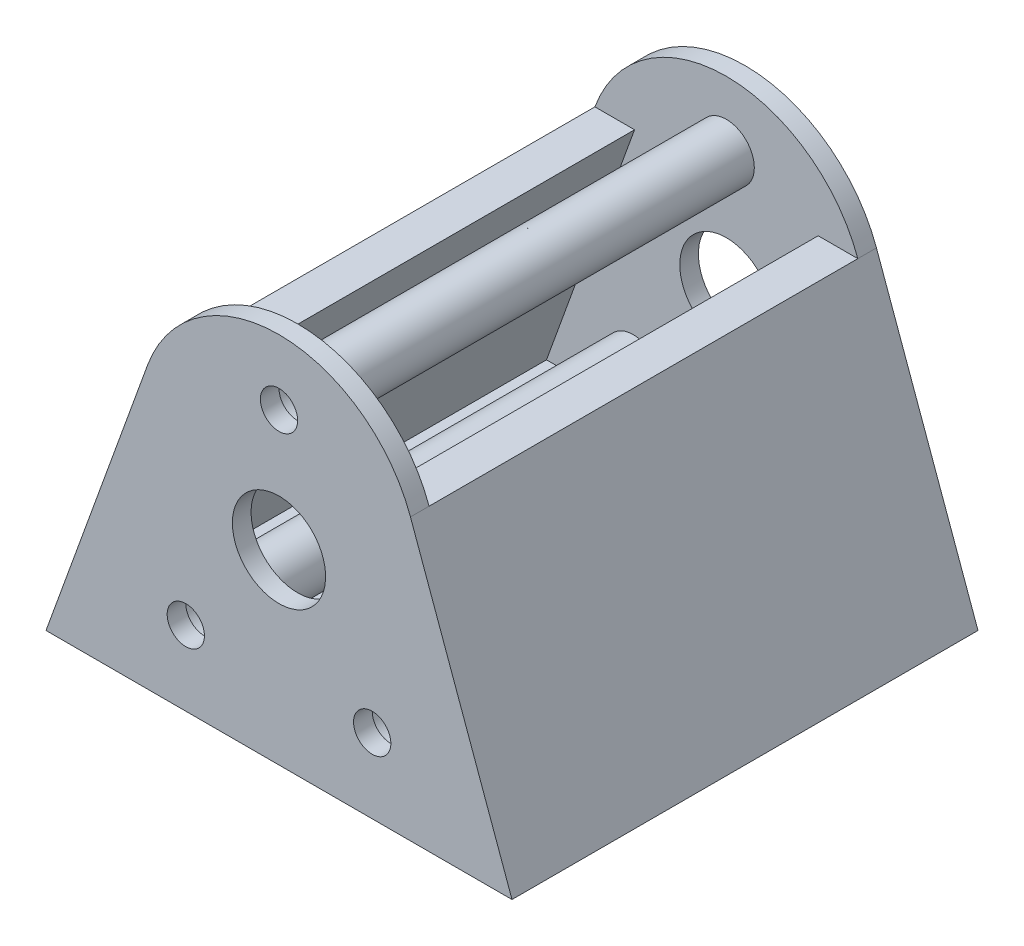
ISO-10303-21;
HEADER;
FILE_DESCRIPTION(('STEP AP214'),'2;1');
FILE_NAME('part.step','',(''),(''),'','','');
FILE_SCHEMA(('AUTOMOTIVE_DESIGN { 1 0 10303 214 1 1 1 1 }'));
ENDSEC;
DATA;
#1=APPLICATION_CONTEXT('core data for automotive mechanical design processes');
#2=APPLICATION_PROTOCOL_DEFINITION('international standard','automotive_design',2000,#1);
#3=PRODUCT_CONTEXT('',#1,'mechanical');
#4=PRODUCT('Part','Part','',(#3));
#5=PRODUCT_RELATED_PRODUCT_CATEGORY('part','',(#4));
#6=PRODUCT_DEFINITION_FORMATION('','',#4);
#7=PRODUCT_DEFINITION_CONTEXT('part definition',#1,'design');
#8=PRODUCT_DEFINITION('design','',#6,#7);
#9=PRODUCT_DEFINITION_SHAPE('','',#8);
#10=(LENGTH_UNIT() NAMED_UNIT(*) SI_UNIT(.MILLI.,.METRE.));
#11=(NAMED_UNIT(*) PLANE_ANGLE_UNIT() SI_UNIT($,.RADIAN.));
#12=(NAMED_UNIT(*) SI_UNIT($,.STERADIAN.) SOLID_ANGLE_UNIT());
#13=UNCERTAINTY_MEASURE_WITH_UNIT(LENGTH_MEASURE(1.E-05),#10,'distance_accuracy_value','');
#14=(GEOMETRIC_REPRESENTATION_CONTEXT(3) GLOBAL_UNCERTAINTY_ASSIGNED_CONTEXT((#13)) GLOBAL_UNIT_ASSIGNED_CONTEXT((#10,
#11,#12)) REPRESENTATION_CONTEXT('',''));
#15=CARTESIAN_POINT('',(0.,0.,0.));
#16=DIRECTION('',(0.,0.,1.));
#17=DIRECTION('',(1.,0.,0.));
#18=AXIS2_PLACEMENT_3D('',#15,#16,#17);
#19=CARTESIAN_POINT('',(0.,0.,2.));
#20=DIRECTION('',(0.,0.,1.));
#21=DIRECTION('',(1.,0.,0.));
#22=AXIS2_PLACEMENT_3D('',#19,#20,#21);
#23=PLANE('',#22);
#24=CARTESIAN_POINT('',(10.,8.,2.));
#25=DIRECTION('',(0.,0.,1.));
#26=DIRECTION('',(1.,0.,0.));
#27=AXIS2_PLACEMENT_3D('',#24,#25,#26);
#28=CIRCLE('',#27,3.);
#29=CARTESIAN_POINT('',(13.,8.,2.));
#30=VERTEX_POINT('',#29);
#31=EDGE_CURVE('E167',#30,#30,#28,.T.);
#32=ORIENTED_EDGE('',*,*,#31,.F.);
#33=EDGE_LOOP('',(#32));
#34=FACE_BOUND('',#33,.T.);
#35=CARTESIAN_POINT('',(0.,33.,2.));
#36=DIRECTION('',(0.,0.,1.));
#37=DIRECTION('',(1.,0.,0.));
#38=AXIS2_PLACEMENT_3D('',#35,#36,#37);
#39=CIRCLE('',#38,3.);
#40=CARTESIAN_POINT('',(3.,33.,2.));
#41=VERTEX_POINT('',#40);
#42=EDGE_CURVE('E188',#41,#41,#39,.T.);
#43=ORIENTED_EDGE('',*,*,#42,.F.);
#44=EDGE_LOOP('',(#43));
#45=FACE_BOUND('',#44,.T.);
#46=CARTESIAN_POINT('',(-10.,8.,2.));
#47=DIRECTION('',(0.,0.,1.));
#48=DIRECTION('',(1.,0.,0.));
#49=AXIS2_PLACEMENT_3D('',#46,#47,#48);
#50=CIRCLE('',#49,3.);
#51=CARTESIAN_POINT('',(-7.,8.,2.));
#52=VERTEX_POINT('',#51);
#53=EDGE_CURVE('E194',#52,#52,#50,.T.);
#54=ORIENTED_EDGE('',*,*,#53,.F.);
#55=EDGE_LOOP('',(#54));
#56=FACE_BOUND('',#55,.T.);
#57=CARTESIAN_POINT('',(0.,20.,2.));
#58=DIRECTION('',(0.,0.,1.));
#59=DIRECTION('',(1.,0.,0.));
#60=AXIS2_PLACEMENT_3D('',#57,#58,#59);
#61=CIRCLE('',#60,5.);
#62=CARTESIAN_POINT('',(5.,20.,2.));
#63=VERTEX_POINT('',#62);
#64=EDGE_CURVE('E249',#63,#63,#61,.T.);
#65=ORIENTED_EDGE('',*,*,#64,.F.);
#66=EDGE_LOOP('',(#65));
#67=FACE_BOUND('',#66,.T.);
#68=DIRECTION('',(0.340312423743285,-0.940312423743285,0.));
#69=VECTOR('',#68,1.);
#70=CARTESIAN_POINT('',(19.2984378812836,4.,2.));
#71=LINE('',#70,#69);
#72=CARTESIAN_POINT('',(9.85078105935823,30.1046863561493,2.));
#73=VERTEX_POINT('',#72);
#74=CARTESIAN_POINT('',(19.2984378812836,4.,2.));
#75=VERTEX_POINT('',#74);
#76=EDGE_CURVE('E63',#73,#75,#71,.T.);
#77=ORIENTED_EDGE('',*,*,#76,.F.);
#78=DIRECTION('',(-1.,0.,0.));
#79=VECTOR('',#78,1.);
#80=CARTESIAN_POINT('',(14.1046863561493,30.1046863561493,2.));
#81=LINE('',#80,#79);
#82=CARTESIAN_POINT('',(14.1046863561493,30.1046863561493,2.));
#83=VERTEX_POINT('',#82);
#84=EDGE_CURVE('E150',#83,#73,#81,.T.);
#85=ORIENTED_EDGE('',*,*,#84,.F.);
#86=CARTESIAN_POINT('',(0.,25.,2.));
#87=DIRECTION('',(0.,0.,1.));
#88=DIRECTION('',(1.,0.,0.));
#89=AXIS2_PLACEMENT_3D('',#86,#87,#88);
#90=CIRCLE('',#89,15.);
#91=CARTESIAN_POINT('',(-14.1046863561493,30.1046863561493,2.));
#92=VERTEX_POINT('',#91);
#93=EDGE_CURVE('E127',#83,#92,#90,.T.);
#94=ORIENTED_EDGE('',*,*,#93,.T.);
#95=DIRECTION('',(-1.,0.,0.));
#96=VECTOR('',#95,1.);
#97=CARTESIAN_POINT('',(-14.1046863561493,30.1046863561493,2.));
#98=LINE('',#97,#96);
#99=CARTESIAN_POINT('',(-9.85078105935822,30.1046863561493,2.));
#100=VERTEX_POINT('',#99);
#101=EDGE_CURVE('E164',#100,#92,#98,.T.);
#102=ORIENTED_EDGE('',*,*,#101,.F.);
#103=DIRECTION('',(0.340312423743285,0.940312423743285,0.));
#104=VECTOR('',#103,1.);
#105=CARTESIAN_POINT('',(-19.2984378812836,4.,2.));
#106=LINE('',#105,#104);
#107=CARTESIAN_POINT('',(-19.2984378812836,4.,2.));
#108=VERTEX_POINT('',#107);
#109=EDGE_CURVE('E168',#108,#100,#106,.T.);
#110=ORIENTED_EDGE('',*,*,#109,.F.);
#111=DIRECTION('',(-1.,0.,0.));
#112=VECTOR('',#111,1.);
#113=CARTESIAN_POINT('',(0.,4.,2.));
#114=LINE('',#113,#112);
#115=EDGE_CURVE('E245',#75,#108,#114,.T.);
#116=ORIENTED_EDGE('',*,*,#115,.F.);
#117=EDGE_LOOP('',(#77,#85,#94,#102,#110,#116));
#118=FACE_BOUND('',#117,.T.);
#119=ADVANCED_FACE('F48',(#34,#45,#56,#67,#118),#23,.T.);
#120=CARTESIAN_POINT('',(0.,4.,-48.1597448159378));
#121=DIRECTION('',(0.,-1.,0.));
#122=DIRECTION('',(1.,0.,0.));
#123=AXIS2_PLACEMENT_3D('',#120,#121,#122);
#124=PLANE('',#123);
#125=DIRECTION('',(0.,0.,1.));
#126=VECTOR('',#125,1.);
#127=CARTESIAN_POINT('',(19.2984378812836,4.,-27.4819852494022));
#128=LINE('',#127,#126);
#129=CARTESIAN_POINT('',(19.2984378812836,4.,48.));
#130=VERTEX_POINT('',#129);
#131=EDGE_CURVE('E71',#75,#130,#128,.T.);
#132=ORIENTED_EDGE('',*,*,#131,.F.);
#133=ORIENTED_EDGE('',*,*,#115,.T.);
#134=DIRECTION('',(0.,0.,1.));
#135=VECTOR('',#134,1.);
#136=CARTESIAN_POINT('',(-19.2984378812836,4.,-27.4819852494022));
#137=LINE('',#136,#135);
#138=CARTESIAN_POINT('',(-19.2984378812836,4.,48.));
#139=VERTEX_POINT('',#138);
#140=EDGE_CURVE('E175',#108,#139,#137,.T.);
#141=ORIENTED_EDGE('',*,*,#140,.T.);
#142=DIRECTION('',(1.,0.,0.));
#143=VECTOR('',#142,1.);
#144=CARTESIAN_POINT('',(0.,4.,48.));
#145=LINE('',#144,#143);
#146=EDGE_CURVE('E244',#139,#130,#145,.T.);
#147=ORIENTED_EDGE('',*,*,#146,.T.);
#148=EDGE_LOOP('',(#132,#133,#141,#147));
#149=FACE_BOUND('',#148,.T.);
#150=ADVANCED_FACE('F339',(#149),#124,.F.);
#151=CARTESIAN_POINT('',(0.,25.,48.));
#152=DIRECTION('',(0.,0.,-1.));
#153=DIRECTION('',(-1.,0.,0.));
#154=AXIS2_PLACEMENT_3D('',#151,#152,#153);
#155=PLANE('',#154);
#156=CARTESIAN_POINT('',(10.,8.,48.));
#157=DIRECTION('',(0.,0.,-1.));
#158=DIRECTION('',(1.,0.,0.));
#159=AXIS2_PLACEMENT_3D('',#156,#157,#158);
#160=CIRCLE('',#159,3.);
#161=CARTESIAN_POINT('',(13.,8.,48.));
#162=VERTEX_POINT('',#161);
#163=EDGE_CURVE('E185',#162,#162,#160,.T.);
#164=ORIENTED_EDGE('',*,*,#163,.F.);
#165=EDGE_LOOP('',(#164));
#166=FACE_BOUND('',#165,.T.);
#167=CARTESIAN_POINT('',(0.,33.,48.));
#168=DIRECTION('',(0.,0.,-1.));
#169=DIRECTION('',(-1.,0.,0.));
#170=AXIS2_PLACEMENT_3D('',#167,#168,#169);
#171=CIRCLE('',#170,3.);
#172=CARTESIAN_POINT('',(-3.,33.,48.));
#173=VERTEX_POINT('',#172);
#174=EDGE_CURVE('E191',#173,#173,#171,.T.);
#175=ORIENTED_EDGE('',*,*,#174,.F.);
#176=EDGE_LOOP('',(#175));
#177=FACE_BOUND('',#176,.T.);
#178=CARTESIAN_POINT('',(-10.,8.,48.));
#179=DIRECTION('',(0.,0.,-1.));
#180=DIRECTION('',(-1.,0.,0.));
#181=AXIS2_PLACEMENT_3D('',#178,#179,#180);
#182=CIRCLE('',#181,3.);
#183=CARTESIAN_POINT('',(-13.,8.,48.));
#184=VERTEX_POINT('',#183);
#185=EDGE_CURVE('E197',#184,#184,#182,.T.);
#186=ORIENTED_EDGE('',*,*,#185,.F.);
#187=EDGE_LOOP('',(#186));
#188=FACE_BOUND('',#187,.T.);
#189=CARTESIAN_POINT('',(0.,20.,48.));
#190=DIRECTION('',(0.,0.,-1.));
#191=DIRECTION('',(-1.,0.,0.));
#192=AXIS2_PLACEMENT_3D('',#189,#190,#191);
#193=CIRCLE('',#192,5.);
#194=CARTESIAN_POINT('',(-5.,20.,48.));
#195=VERTEX_POINT('',#194);
#196=EDGE_CURVE('E203',#195,#195,#193,.T.);
#197=ORIENTED_EDGE('',*,*,#196,.F.);
#198=EDGE_LOOP('',(#197));
#199=FACE_BOUND('',#198,.T.);
#200=CARTESIAN_POINT('',(0.,25.,48.));
#201=DIRECTION('',(0.,0.,-1.));
#202=DIRECTION('',(-1.,0.,0.));
#203=AXIS2_PLACEMENT_3D('',#200,#201,#202);
#204=CIRCLE('',#203,15.);
#205=CARTESIAN_POINT('',(-14.1046863561493,30.1046863561493,48.));
#206=VERTEX_POINT('',#205);
#207=CARTESIAN_POINT('',(14.1046863561493,30.1046863561493,48.));
#208=VERTEX_POINT('',#207);
#209=EDGE_CURVE('E227',#206,#208,#204,.T.);
#210=ORIENTED_EDGE('',*,*,#209,.T.);
#211=DIRECTION('',(1.,0.,0.));
#212=VECTOR('',#211,1.);
#213=CARTESIAN_POINT('',(14.1046863561493,30.1046863561493,48.));
#214=LINE('',#213,#212);
#215=CARTESIAN_POINT('',(9.85078105935822,30.1046863561493,48.));
#216=VERTEX_POINT('',#215);
#217=EDGE_CURVE('E155',#216,#208,#214,.T.);
#218=ORIENTED_EDGE('',*,*,#217,.F.);
#219=DIRECTION('',(-0.340312423743285,0.940312423743285,0.));
#220=VECTOR('',#219,1.);
#221=CARTESIAN_POINT('',(19.2984378812836,4.,48.));
#222=LINE('',#221,#220);
#223=EDGE_CURVE('E159',#130,#216,#222,.T.);
#224=ORIENTED_EDGE('',*,*,#223,.F.);
#225=ORIENTED_EDGE('',*,*,#146,.F.);
#226=DIRECTION('',(-0.340312423743285,-0.940312423743285,0.));
#227=VECTOR('',#226,1.);
#228=CARTESIAN_POINT('',(-19.2984378812836,4.,48.));
#229=LINE('',#228,#227);
#230=CARTESIAN_POINT('',(-9.85078105935822,30.1046863561493,48.));
#231=VERTEX_POINT('',#230);
#232=EDGE_CURVE('E172',#231,#139,#229,.T.);
#233=ORIENTED_EDGE('',*,*,#232,.F.);
#234=DIRECTION('',(1.,0.,0.));
#235=VECTOR('',#234,1.);
#236=CARTESIAN_POINT('',(-14.1046863561493,30.1046863561493,48.));
#237=LINE('',#236,#235);
#238=EDGE_CURVE('E169',#206,#231,#237,.T.);
#239=ORIENTED_EDGE('',*,*,#238,.F.);
#240=EDGE_LOOP('',(#210,#218,#224,#225,#233,#239));
#241=FACE_BOUND('',#240,.T.);
#242=ADVANCED_FACE('F341',(#166,#177,#188,#199,#241),#155,.T.);
#243=CARTESIAN_POINT('',(10.,8.,2.));
#244=DIRECTION('',(0.,0.,1.));
#245=DIRECTION('',(1.,0.,0.));
#246=AXIS2_PLACEMENT_3D('',#243,#244,#245);
#247=CIRCLE('',#246,2.);
#248=CARTESIAN_POINT('',(12.,8.,2.));
#249=VERTEX_POINT('',#248);
#250=EDGE_CURVE('E257',#249,#249,#247,.F.);
#251=ORIENTED_EDGE('',*,*,#250,.T.);
#252=EDGE_LOOP('',(#251));
#253=FACE_BOUND('',#252,.T.);
#254=CARTESIAN_POINT('',(10.,8.,2.));
#255=DIRECTION('',(0.,0.,1.));
#256=DIRECTION('',(1.,0.,0.));
#257=AXIS2_PLACEMENT_3D('',#254,#255,#256);
#258=CIRCLE('',#257,2.5);
#259=CARTESIAN_POINT('',(12.5,8.,2.));
#260=VERTEX_POINT('',#259);
#261=EDGE_CURVE('E298',#260,#260,#258,.F.);
#262=ORIENTED_EDGE('',*,*,#261,.F.);
#263=EDGE_LOOP('',(#262));
#264=FACE_BOUND('',#263,.T.);
#265=ADVANCED_FACE('F406',(#253,#264),#23,.T.);
#266=CARTESIAN_POINT('',(10.,8.,48.));
#267=DIRECTION('',(0.,0.,-1.));
#268=DIRECTION('',(-1.,0.,0.));
#269=AXIS2_PLACEMENT_3D('',#266,#267,#268);
#270=CIRCLE('',#269,2.);
#271=CARTESIAN_POINT('',(8.,8.,48.));
#272=VERTEX_POINT('',#271);
#273=EDGE_CURVE('E221',#272,#272,#270,.T.);
#274=ORIENTED_EDGE('',*,*,#273,.F.);
#275=EDGE_LOOP('',(#274));
#276=FACE_BOUND('',#275,.T.);
#277=CARTESIAN_POINT('',(10.,8.,48.));
#278=DIRECTION('',(0.,0.,-1.));
#279=DIRECTION('',(-1.,0.,0.));
#280=AXIS2_PLACEMENT_3D('',#277,#278,#279);
#281=CIRCLE('',#280,2.5);
#282=CARTESIAN_POINT('',(7.5,8.,48.));
#283=VERTEX_POINT('',#282);
#284=EDGE_CURVE('E295',#283,#283,#281,.F.);
#285=ORIENTED_EDGE('',*,*,#284,.F.);
#286=EDGE_LOOP('',(#285));
#287=FACE_BOUND('',#286,.T.);
#288=ADVANCED_FACE('F416',(#276,#287),#155,.T.);
#289=CARTESIAN_POINT('',(0.,33.,2.));
#290=DIRECTION('',(0.,0.,1.));
#291=DIRECTION('',(1.,0.,0.));
#292=AXIS2_PLACEMENT_3D('',#289,#290,#291);
#293=CIRCLE('',#292,2.);
#294=CARTESIAN_POINT('',(2.,33.,2.));
#295=VERTEX_POINT('',#294);
#296=EDGE_CURVE('E136',#295,#295,#293,.T.);
#297=ORIENTED_EDGE('',*,*,#296,.F.);
#298=EDGE_LOOP('',(#297));
#299=FACE_BOUND('',#298,.T.);
#300=CARTESIAN_POINT('',(0.,33.,2.));
#301=DIRECTION('',(0.,0.,1.));
#302=DIRECTION('',(1.,0.,0.));
#303=AXIS2_PLACEMENT_3D('',#300,#301,#302);
#304=CIRCLE('',#303,2.5);
#305=CARTESIAN_POINT('',(2.5,33.,2.));
#306=VERTEX_POINT('',#305);
#307=EDGE_CURVE('E292',#306,#306,#304,.F.);
#308=ORIENTED_EDGE('',*,*,#307,.F.);
#309=EDGE_LOOP('',(#308));
#310=FACE_BOUND('',#309,.T.);
#311=ADVANCED_FACE('F418',(#299,#310),#23,.T.);
#312=CARTESIAN_POINT('',(0.,33.,48.));
#313=DIRECTION('',(0.,0.,-1.));
#314=DIRECTION('',(-1.,0.,0.));
#315=AXIS2_PLACEMENT_3D('',#312,#313,#314);
#316=CIRCLE('',#315,2.);
#317=CARTESIAN_POINT('',(-2.,33.,48.));
#318=VERTEX_POINT('',#317);
#319=EDGE_CURVE('E209',#318,#318,#316,.T.);
#320=ORIENTED_EDGE('',*,*,#319,.F.);
#321=EDGE_LOOP('',(#320));
#322=FACE_BOUND('',#321,.T.);
#323=CARTESIAN_POINT('',(0.,33.,48.));
#324=DIRECTION('',(0.,0.,-1.));
#325=DIRECTION('',(-1.,0.,0.));
#326=AXIS2_PLACEMENT_3D('',#323,#324,#325);
#327=CIRCLE('',#326,2.5);
#328=CARTESIAN_POINT('',(-2.5,33.,48.));
#329=VERTEX_POINT('',#328);
#330=EDGE_CURVE('E289',#329,#329,#327,.F.);
#331=ORIENTED_EDGE('',*,*,#330,.F.);
#332=EDGE_LOOP('',(#331));
#333=FACE_BOUND('',#332,.T.);
#334=ADVANCED_FACE('F420',(#322,#333),#155,.T.);
#335=CARTESIAN_POINT('',(-10.,8.,2.));
#336=DIRECTION('',(0.,0.,1.));
#337=DIRECTION('',(1.,0.,0.));
#338=AXIS2_PLACEMENT_3D('',#335,#336,#337);
#339=CIRCLE('',#338,2.);
#340=CARTESIAN_POINT('',(-8.,8.,2.));
#341=VERTEX_POINT('',#340);
#342=EDGE_CURVE('E135',#341,#341,#339,.T.);
#343=ORIENTED_EDGE('',*,*,#342,.F.);
#344=EDGE_LOOP('',(#343));
#345=FACE_BOUND('',#344,.T.);
#346=CARTESIAN_POINT('',(-10.,8.,2.));
#347=DIRECTION('',(0.,0.,1.));
#348=DIRECTION('',(1.,0.,0.));
#349=AXIS2_PLACEMENT_3D('',#346,#347,#348);
#350=CIRCLE('',#349,2.5);
#351=CARTESIAN_POINT('',(-7.5,8.,2.));
#352=VERTEX_POINT('',#351);
#353=EDGE_CURVE('E286',#352,#352,#350,.F.);
#354=ORIENTED_EDGE('',*,*,#353,.F.);
#355=EDGE_LOOP('',(#354));
#356=FACE_BOUND('',#355,.T.);
#357=ADVANCED_FACE('F407',(#345,#356),#23,.T.);
#358=CARTESIAN_POINT('',(-10.,8.,48.));
#359=DIRECTION('',(0.,0.,-1.));
#360=DIRECTION('',(-1.,0.,0.));
#361=AXIS2_PLACEMENT_3D('',#358,#359,#360);
#362=CIRCLE('',#361,2.);
#363=CARTESIAN_POINT('',(-12.,8.,48.));
#364=VERTEX_POINT('',#363);
#365=EDGE_CURVE('E215',#364,#364,#362,.T.);
#366=ORIENTED_EDGE('',*,*,#365,.F.);
#367=EDGE_LOOP('',(#366));
#368=FACE_BOUND('',#367,.T.);
#369=CARTESIAN_POINT('',(-10.,8.,48.));
#370=DIRECTION('',(0.,0.,-1.));
#371=DIRECTION('',(-1.,0.,0.));
#372=AXIS2_PLACEMENT_3D('',#369,#370,#371);
#373=CIRCLE('',#372,2.5);
#374=CARTESIAN_POINT('',(-12.5,8.,48.));
#375=VERTEX_POINT('',#374);
#376=EDGE_CURVE('E283',#375,#375,#373,.F.);
#377=ORIENTED_EDGE('',*,*,#376,.F.);
#378=EDGE_LOOP('',(#377));
#379=FACE_BOUND('',#378,.T.);
#380=ADVANCED_FACE('F314',(#368,#379),#155,.T.);
#381=CARTESIAN_POINT('',(0.,0.,2.));
#382=DIRECTION('',(0.,1.,0.));
#383=DIRECTION('',(0.,0.,1.));
#384=AXIS2_PLACEMENT_3D('',#381,#382,#383);
#385=PLANE('',#384);
#386=CARTESIAN_POINT('',(12.5,0.,12.5));
#387=DIRECTION('',(0.,1.,0.));
#388=DIRECTION('',(0.,0.,1.));
#389=AXIS2_PLACEMENT_3D('',#386,#387,#388);
#390=CIRCLE('',#389,5.);
#391=CARTESIAN_POINT('',(12.5,0.,17.5));
#392=VERTEX_POINT('',#391);
#393=EDGE_CURVE('E13',#392,#392,#390,.F.);
#394=ORIENTED_EDGE('',*,*,#393,.F.);
#395=EDGE_LOOP('',(#394));
#396=FACE_BOUND('',#395,.T.);
#397=CARTESIAN_POINT('',(12.5,0.,37.5));
#398=DIRECTION('',(0.,1.,0.));
#399=DIRECTION('',(0.,0.,1.));
#400=AXIS2_PLACEMENT_3D('',#397,#398,#399);
#401=CIRCLE('',#400,5.);
#402=CARTESIAN_POINT('',(12.5,0.,42.5));
#403=VERTEX_POINT('',#402);
#404=EDGE_CURVE('E56',#403,#403,#401,.F.);
#405=ORIENTED_EDGE('',*,*,#404,.F.);
#406=EDGE_LOOP('',(#405));
#407=FACE_BOUND('',#406,.T.);
#408=CARTESIAN_POINT('',(-12.5,0.,37.5));
#409=DIRECTION('',(0.,1.,0.));
#410=DIRECTION('',(0.,0.,1.));
#411=AXIS2_PLACEMENT_3D('',#408,#409,#410);
#412=CIRCLE('',#411,5.);
#413=CARTESIAN_POINT('',(-12.5,0.,42.5));
#414=VERTEX_POINT('',#413);
#415=EDGE_CURVE('E304',#414,#414,#412,.F.);
#416=ORIENTED_EDGE('',*,*,#415,.F.);
#417=EDGE_LOOP('',(#416));
#418=FACE_BOUND('',#417,.T.);
#419=CARTESIAN_POINT('',(-12.5,0.,12.5));
#420=DIRECTION('',(0.,1.,0.));
#421=DIRECTION('',(0.,0.,1.));
#422=AXIS2_PLACEMENT_3D('',#419,#420,#421);
#423=CIRCLE('',#422,5.);
#424=CARTESIAN_POINT('',(-12.5,0.,17.5));
#425=VERTEX_POINT('',#424);
#426=EDGE_CURVE('E301',#425,#425,#423,.F.);
#427=ORIENTED_EDGE('',*,*,#426,.F.);
#428=EDGE_LOOP('',(#427));
#429=FACE_BOUND('',#428,.T.);
#430=DIRECTION('',(1.,0.,0.));
#431=VECTOR('',#430,1.);
#432=CARTESIAN_POINT('',(0.,0.,0.));
#433=LINE('',#432,#431);
#434=CARTESIAN_POINT('',(-25.,0.,0.));
#435=VERTEX_POINT('',#434);
#436=CARTESIAN_POINT('',(25.,0.,0.));
#437=VERTEX_POINT('',#436);
#438=EDGE_CURVE('E266',#435,#437,#433,.T.);
#439=ORIENTED_EDGE('',*,*,#438,.T.);
#440=DIRECTION('',(0.,0.,-1.));
#441=VECTOR('',#440,1.);
#442=CARTESIAN_POINT('',(25.,0.,2.));
#443=LINE('',#442,#441);
#444=CARTESIAN_POINT('',(25.,0.,50.));
#445=VERTEX_POINT('',#444);
#446=EDGE_CURVE('E147',#445,#437,#443,.T.);
#447=ORIENTED_EDGE('',*,*,#446,.F.);
#448=DIRECTION('',(-1.,0.,0.));
#449=VECTOR('',#448,1.);
#450=CARTESIAN_POINT('',(25.,0.,50.));
#451=LINE('',#450,#449);
#452=CARTESIAN_POINT('',(-25.,0.,50.));
#453=VERTEX_POINT('',#452);
#454=EDGE_CURVE('E230',#445,#453,#451,.T.);
#455=ORIENTED_EDGE('',*,*,#454,.T.);
#456=DIRECTION('',(0.,0.,-1.));
#457=VECTOR('',#456,1.);
#458=CARTESIAN_POINT('',(-25.,0.,2.));
#459=LINE('',#458,#457);
#460=EDGE_CURVE('E260',#453,#435,#459,.T.);
#461=ORIENTED_EDGE('',*,*,#460,.T.);
#462=EDGE_LOOP('',(#439,#447,#455,#461));
#463=FACE_BOUND('',#462,.T.);
#464=ADVANCED_FACE('F311',(#396,#407,#418,#429,#463),#385,.F.);
#465=CARTESIAN_POINT('',(22.1046863561493,8.,2.));
#466=DIRECTION('',(-0.940312423743285,-0.340312423743285,0.));
#467=DIRECTION('',(0.340312423743285,-0.940312423743285,0.));
#468=AXIS2_PLACEMENT_3D('',#465,#466,#467);
#469=PLANE('',#468);
#470=DIRECTION('',(0.,0.,1.));
#471=VECTOR('',#470,1.);
#472=CARTESIAN_POINT('',(14.1046863561493,30.1046863561493,-27.4819852494022));
#473=LINE('',#472,#471);
#474=EDGE_CURVE('E143',#83,#208,#473,.T.);
#475=ORIENTED_EDGE('',*,*,#474,.T.);
#476=DIRECTION('',(0.,0.,1.));
#477=VECTOR('',#476,1.);
#478=CARTESIAN_POINT('',(14.1046863561493,30.1046863561493,48.));
#479=LINE('',#478,#477);
#480=CARTESIAN_POINT('',(14.1046863561493,30.1046863561493,50.));
#481=VERTEX_POINT('',#480);
#482=EDGE_CURVE('E229',#208,#481,#479,.T.);
#483=ORIENTED_EDGE('',*,*,#482,.T.);
#484=DIRECTION('',(0.340312423743285,-0.940312423743285,0.));
#485=VECTOR('',#484,1.);
#486=CARTESIAN_POINT('',(14.1046863561493,30.1046863561493,50.));
#487=LINE('',#486,#485);
#488=EDGE_CURVE('E235',#481,#445,#487,.T.);
#489=ORIENTED_EDGE('',*,*,#488,.T.);
#490=ORIENTED_EDGE('',*,*,#446,.T.);
#491=DIRECTION('',(-0.340312423743285,0.940312423743285,0.));
#492=VECTOR('',#491,1.);
#493=CARTESIAN_POINT('',(22.1046863561493,8.,0.));
#494=LINE('',#493,#492);
#495=CARTESIAN_POINT('',(14.1046863561493,30.1046863561493,0.));
#496=VERTEX_POINT('',#495);
#497=EDGE_CURVE('E146',#437,#496,#494,.T.);
#498=ORIENTED_EDGE('',*,*,#497,.T.);
#499=DIRECTION('',(0.,0.,-1.));
#500=VECTOR('',#499,1.);
#501=CARTESIAN_POINT('',(14.1046863561493,30.1046863561493,2.));
#502=LINE('',#501,#500);
#503=EDGE_CURVE('E131',#83,#496,#502,.T.);
#504=ORIENTED_EDGE('',*,*,#503,.F.);
#505=EDGE_LOOP('',(#475,#483,#489,#490,#498,#504));
#506=FACE_BOUND('',#505,.T.);
#507=ADVANCED_FACE('F140',(#506),#469,.F.);
#508=CARTESIAN_POINT('',(0.,25.,2.));
#509=DIRECTION('',(0.,0.,-1.));
#510=DIRECTION('',(-1.,0.,0.));
#511=AXIS2_PLACEMENT_3D('',#508,#509,#510);
#512=CYLINDRICAL_SURFACE('',#511,15.);
#513=CARTESIAN_POINT('',(0.,25.,0.));
#514=DIRECTION('',(0.,0.,1.));
#515=DIRECTION('',(1.,0.,0.));
#516=AXIS2_PLACEMENT_3D('',#513,#514,#515);
#517=CIRCLE('',#516,15.);
#518=CARTESIAN_POINT('',(-14.1046863561493,30.1046863561493,0.));
#519=VERTEX_POINT('',#518);
#520=EDGE_CURVE('E270',#496,#519,#517,.T.);
#521=ORIENTED_EDGE('',*,*,#520,.T.);
#522=DIRECTION('',(0.,0.,-1.));
#523=VECTOR('',#522,1.);
#524=CARTESIAN_POINT('',(-14.1046863561493,30.1046863561493,2.));
#525=LINE('',#524,#523);
#526=EDGE_CURVE('E133',#92,#519,#525,.T.);
#527=ORIENTED_EDGE('',*,*,#526,.F.);
#528=ORIENTED_EDGE('',*,*,#93,.F.);
#529=ORIENTED_EDGE('',*,*,#503,.T.);
#530=EDGE_LOOP('',(#521,#527,#528,#529));
#531=FACE_BOUND('',#530,.T.);
#532=ADVANCED_FACE('F130',(#531),#512,.T.);
#533=CARTESIAN_POINT('',(-10.,8.,2.));
#534=DIRECTION('',(0.,0.,-1.));
#535=DIRECTION('',(-1.,0.,0.));
#536=AXIS2_PLACEMENT_3D('',#533,#534,#535);
#537=CYLINDRICAL_SURFACE('',#536,2.);
#538=ORIENTED_EDGE('',*,*,#342,.T.);
#539=EDGE_LOOP('',(#538));
#540=FACE_BOUND('',#539,.T.);
#541=CARTESIAN_POINT('',(-10.,8.,0.));
#542=DIRECTION('',(0.,0.,1.));
#543=DIRECTION('',(1.,0.,0.));
#544=AXIS2_PLACEMENT_3D('',#541,#542,#543);
#545=CIRCLE('',#544,2.);
#546=CARTESIAN_POINT('',(-8.,8.,0.));
#547=VERTEX_POINT('',#546);
#548=EDGE_CURVE('E275',#547,#547,#545,.T.);
#549=ORIENTED_EDGE('',*,*,#548,.F.);
#550=EDGE_LOOP('',(#549));
#551=FACE_BOUND('',#550,.T.);
#552=ADVANCED_FACE('F602',(#540,#551),#537,.F.);
#553=CARTESIAN_POINT('',(-22.1046863561493,8.,2.));
#554=DIRECTION('',(-0.940312423743285,0.340312423743285,0.));
#555=DIRECTION('',(-0.340312423743285,-0.940312423743285,0.));
#556=AXIS2_PLACEMENT_3D('',#553,#554,#555);
#557=PLANE('',#556);
#558=DIRECTION('',(0.,0.,1.));
#559=VECTOR('',#558,1.);
#560=CARTESIAN_POINT('',(-14.1046863561493,30.1046863561493,-27.4819852494022));
#561=LINE('',#560,#559);
#562=EDGE_CURVE('E180',#92,#206,#561,.T.);
#563=ORIENTED_EDGE('',*,*,#562,.F.);
#564=ORIENTED_EDGE('',*,*,#526,.T.);
#565=DIRECTION('',(0.340312423743285,0.940312423743285,0.));
#566=VECTOR('',#565,1.);
#567=CARTESIAN_POINT('',(-22.1046863561493,8.,0.));
#568=LINE('',#567,#566);
#569=EDGE_CURVE('E272',#435,#519,#568,.T.);
#570=ORIENTED_EDGE('',*,*,#569,.F.);
#571=ORIENTED_EDGE('',*,*,#460,.F.);
#572=DIRECTION('',(0.340312423743285,0.940312423743285,0.));
#573=VECTOR('',#572,1.);
#574=CARTESIAN_POINT('',(-25.,0.,50.));
#575=LINE('',#574,#573);
#576=CARTESIAN_POINT('',(-14.1046863561493,30.1046863561493,50.));
#577=VERTEX_POINT('',#576);
#578=EDGE_CURVE('E224',#453,#577,#575,.T.);
#579=ORIENTED_EDGE('',*,*,#578,.T.);
#580=DIRECTION('',(0.,0.,1.));
#581=VECTOR('',#580,1.);
#582=CARTESIAN_POINT('',(-14.1046863561493,30.1046863561493,48.));
#583=LINE('',#582,#581);
#584=EDGE_CURVE('E241',#206,#577,#583,.T.);
#585=ORIENTED_EDGE('',*,*,#584,.F.);
#586=EDGE_LOOP('',(#563,#564,#570,#571,#579,#585));
#587=FACE_BOUND('',#586,.T.);
#588=ADVANCED_FACE('F329',(#587),#557,.T.);
#589=CARTESIAN_POINT('',(0.,33.,2.));
#590=DIRECTION('',(0.,0.,-1.));
#591=DIRECTION('',(-1.,0.,0.));
#592=AXIS2_PLACEMENT_3D('',#589,#590,#591);
#593=CYLINDRICAL_SURFACE('',#592,2.);
#594=ORIENTED_EDGE('',*,*,#296,.T.);
#595=EDGE_LOOP('',(#594));
#596=FACE_BOUND('',#595,.T.);
#597=CARTESIAN_POINT('',(0.,33.,0.));
#598=DIRECTION('',(0.,0.,1.));
#599=DIRECTION('',(1.,0.,0.));
#600=AXIS2_PLACEMENT_3D('',#597,#598,#599);
#601=CIRCLE('',#600,2.);
#602=CARTESIAN_POINT('',(2.,33.,0.));
#603=VERTEX_POINT('',#602);
#604=EDGE_CURVE('E263',#603,#603,#601,.T.);
#605=ORIENTED_EDGE('',*,*,#604,.F.);
#606=EDGE_LOOP('',(#605));
#607=FACE_BOUND('',#606,.T.);
#608=ADVANCED_FACE('F612',(#596,#607),#593,.F.);
#609=CARTESIAN_POINT('',(0.,20.,2.));
#610=DIRECTION('',(0.,0.,-1.));
#611=DIRECTION('',(-1.,0.,0.));
#612=AXIS2_PLACEMENT_3D('',#609,#610,#611);
#613=CYLINDRICAL_SURFACE('',#612,5.);
#614=ORIENTED_EDGE('',*,*,#64,.T.);
#615=EDGE_LOOP('',(#614));
#616=FACE_BOUND('',#615,.T.);
#617=CARTESIAN_POINT('',(0.,20.,0.));
#618=DIRECTION('',(0.,0.,1.));
#619=DIRECTION('',(1.,0.,0.));
#620=AXIS2_PLACEMENT_3D('',#617,#618,#619);
#621=CIRCLE('',#620,5.);
#622=CARTESIAN_POINT('',(5.,20.,0.));
#623=VERTEX_POINT('',#622);
#624=EDGE_CURVE('E247',#623,#623,#621,.T.);
#625=ORIENTED_EDGE('',*,*,#624,.F.);
#626=EDGE_LOOP('',(#625));
#627=FACE_BOUND('',#626,.T.);
#628=ADVANCED_FACE('F50',(#616,#627),#613,.F.);
#629=CARTESIAN_POINT('',(10.,8.,2.));
#630=DIRECTION('',(0.,0.,-1.));
#631=DIRECTION('',(-1.,0.,0.));
#632=AXIS2_PLACEMENT_3D('',#629,#630,#631);
#633=CYLINDRICAL_SURFACE('',#632,2.);
#634=ORIENTED_EDGE('',*,*,#250,.F.);
#635=EDGE_LOOP('',(#634));
#636=FACE_BOUND('',#635,.T.);
#637=CARTESIAN_POINT('',(10.,8.,0.));
#638=DIRECTION('',(0.,0.,1.));
#639=DIRECTION('',(1.,0.,0.));
#640=AXIS2_PLACEMENT_3D('',#637,#638,#639);
#641=CIRCLE('',#640,2.);
#642=CARTESIAN_POINT('',(12.,8.,0.));
#643=VERTEX_POINT('',#642);
#644=EDGE_CURVE('E252',#643,#643,#641,.F.);
#645=ORIENTED_EDGE('',*,*,#644,.T.);
#646=EDGE_LOOP('',(#645));
#647=FACE_BOUND('',#646,.T.);
#648=ADVANCED_FACE('F631',(#636,#647),#633,.F.);
#649=CARTESIAN_POINT('',(0.,0.,0.));
#650=DIRECTION('',(0.,0.,1.));
#651=DIRECTION('',(1.,0.,0.));
#652=AXIS2_PLACEMENT_3D('',#649,#650,#651);
#653=PLANE('',#652);
#654=ORIENTED_EDGE('',*,*,#624,.T.);
#655=EDGE_LOOP('',(#654));
#656=FACE_BOUND('',#655,.T.);
#657=ORIENTED_EDGE('',*,*,#604,.T.);
#658=EDGE_LOOP('',(#657));
#659=FACE_BOUND('',#658,.T.);
#660=ORIENTED_EDGE('',*,*,#438,.F.);
#661=ORIENTED_EDGE('',*,*,#569,.T.);
#662=ORIENTED_EDGE('',*,*,#520,.F.);
#663=ORIENTED_EDGE('',*,*,#497,.F.);
#664=EDGE_LOOP('',(#660,#661,#662,#663));
#665=FACE_BOUND('',#664,.T.);
#666=ORIENTED_EDGE('',*,*,#548,.T.);
#667=EDGE_LOOP('',(#666));
#668=FACE_BOUND('',#667,.T.);
#669=ORIENTED_EDGE('',*,*,#644,.F.);
#670=EDGE_LOOP('',(#669));
#671=FACE_BOUND('',#670,.T.);
#672=ADVANCED_FACE('F326',(#656,#659,#665,#668,#671),#653,.F.);
#673=CARTESIAN_POINT('',(0.,25.,50.));
#674=DIRECTION('',(0.,0.,-1.));
#675=DIRECTION('',(-1.,0.,0.));
#676=AXIS2_PLACEMENT_3D('',#673,#674,#675);
#677=PLANE('',#676);
#678=ORIENTED_EDGE('',*,*,#578,.F.);
#679=ORIENTED_EDGE('',*,*,#454,.F.);
#680=ORIENTED_EDGE('',*,*,#488,.F.);
#681=CARTESIAN_POINT('',(0.,25.,50.));
#682=DIRECTION('',(0.,0.,-1.));
#683=DIRECTION('',(-1.,0.,0.));
#684=AXIS2_PLACEMENT_3D('',#681,#682,#683);
#685=CIRCLE('',#684,15.);
#686=EDGE_CURVE('E233',#577,#481,#685,.T.);
#687=ORIENTED_EDGE('',*,*,#686,.F.);
#688=EDGE_LOOP('',(#678,#679,#680,#687));
#689=FACE_BOUND('',#688,.T.);
#690=CARTESIAN_POINT('',(10.,8.,50.));
#691=DIRECTION('',(0.,0.,-1.));
#692=DIRECTION('',(-1.,0.,0.));
#693=AXIS2_PLACEMENT_3D('',#690,#691,#692);
#694=CIRCLE('',#693,2.);
#695=CARTESIAN_POINT('',(8.,8.,50.));
#696=VERTEX_POINT('',#695);
#697=EDGE_CURVE('E218',#696,#696,#694,.T.);
#698=ORIENTED_EDGE('',*,*,#697,.T.);
#699=EDGE_LOOP('',(#698));
#700=FACE_BOUND('',#699,.T.);
#701=CARTESIAN_POINT('',(-10.,8.,50.));
#702=DIRECTION('',(0.,0.,-1.));
#703=DIRECTION('',(-1.,0.,0.));
#704=AXIS2_PLACEMENT_3D('',#701,#702,#703);
#705=CIRCLE('',#704,2.);
#706=CARTESIAN_POINT('',(-12.,8.,50.));
#707=VERTEX_POINT('',#706);
#708=EDGE_CURVE('E212',#707,#707,#705,.T.);
#709=ORIENTED_EDGE('',*,*,#708,.T.);
#710=EDGE_LOOP('',(#709));
#711=FACE_BOUND('',#710,.T.);
#712=CARTESIAN_POINT('',(0.,33.,50.));
#713=DIRECTION('',(0.,0.,-1.));
#714=DIRECTION('',(-1.,0.,0.));
#715=AXIS2_PLACEMENT_3D('',#712,#713,#714);
#716=CIRCLE('',#715,2.);
#717=CARTESIAN_POINT('',(-2.,33.,50.));
#718=VERTEX_POINT('',#717);
#719=EDGE_CURVE('E206',#718,#718,#716,.T.);
#720=ORIENTED_EDGE('',*,*,#719,.T.);
#721=EDGE_LOOP('',(#720));
#722=FACE_BOUND('',#721,.T.);
#723=CARTESIAN_POINT('',(0.,20.,50.));
#724=DIRECTION('',(0.,0.,-1.));
#725=DIRECTION('',(-1.,0.,0.));
#726=AXIS2_PLACEMENT_3D('',#723,#724,#725);
#727=CIRCLE('',#726,5.);
#728=CARTESIAN_POINT('',(-5.,20.,50.));
#729=VERTEX_POINT('',#728);
#730=EDGE_CURVE('E200',#729,#729,#727,.T.);
#731=ORIENTED_EDGE('',*,*,#730,.T.);
#732=EDGE_LOOP('',(#731));
#733=FACE_BOUND('',#732,.T.);
#734=ADVANCED_FACE('F483',(#689,#700,#711,#722,#733),#677,.F.);
#735=CARTESIAN_POINT('',(0.,25.,48.));
#736=DIRECTION('',(0.,0.,1.));
#737=DIRECTION('',(1.,0.,0.));
#738=AXIS2_PLACEMENT_3D('',#735,#736,#737);
#739=CYLINDRICAL_SURFACE('',#738,15.);
#740=ORIENTED_EDGE('',*,*,#686,.T.);
#741=ORIENTED_EDGE('',*,*,#482,.F.);
#742=ORIENTED_EDGE('',*,*,#209,.F.);
#743=ORIENTED_EDGE('',*,*,#584,.T.);
#744=EDGE_LOOP('',(#740,#741,#742,#743));
#745=FACE_BOUND('',#744,.T.);
#746=ADVANCED_FACE('F478',(#745),#739,.T.);
#747=CARTESIAN_POINT('',(10.,8.,48.));
#748=DIRECTION('',(0.,0.,1.));
#749=DIRECTION('',(1.,0.,0.));
#750=AXIS2_PLACEMENT_3D('',#747,#748,#749);
#751=CYLINDRICAL_SURFACE('',#750,2.);
#752=ORIENTED_EDGE('',*,*,#273,.T.);
#753=EDGE_LOOP('',(#752));
#754=FACE_BOUND('',#753,.T.);
#755=ORIENTED_EDGE('',*,*,#697,.F.);
#756=EDGE_LOOP('',(#755));
#757=FACE_BOUND('',#756,.T.);
#758=ADVANCED_FACE('F475',(#754,#757),#751,.F.);
#759=CARTESIAN_POINT('',(-10.,8.,48.));
#760=DIRECTION('',(0.,0.,1.));
#761=DIRECTION('',(1.,0.,0.));
#762=AXIS2_PLACEMENT_3D('',#759,#760,#761);
#763=CYLINDRICAL_SURFACE('',#762,2.);
#764=ORIENTED_EDGE('',*,*,#365,.T.);
#765=EDGE_LOOP('',(#764));
#766=FACE_BOUND('',#765,.T.);
#767=ORIENTED_EDGE('',*,*,#708,.F.);
#768=EDGE_LOOP('',(#767));
#769=FACE_BOUND('',#768,.T.);
#770=ADVANCED_FACE('F471',(#766,#769),#763,.F.);
#771=CARTESIAN_POINT('',(0.,33.,48.));
#772=DIRECTION('',(0.,0.,1.));
#773=DIRECTION('',(1.,0.,0.));
#774=AXIS2_PLACEMENT_3D('',#771,#772,#773);
#775=CYLINDRICAL_SURFACE('',#774,2.);
#776=ORIENTED_EDGE('',*,*,#319,.T.);
#777=EDGE_LOOP('',(#776));
#778=FACE_BOUND('',#777,.T.);
#779=ORIENTED_EDGE('',*,*,#719,.F.);
#780=EDGE_LOOP('',(#779));
#781=FACE_BOUND('',#780,.T.);
#782=ADVANCED_FACE('F467',(#778,#781),#775,.F.);
#783=CARTESIAN_POINT('',(0.,20.,48.));
#784=DIRECTION('',(0.,0.,1.));
#785=DIRECTION('',(1.,0.,0.));
#786=AXIS2_PLACEMENT_3D('',#783,#784,#785);
#787=CYLINDRICAL_SURFACE('',#786,5.);
#788=ORIENTED_EDGE('',*,*,#196,.T.);
#789=EDGE_LOOP('',(#788));
#790=FACE_BOUND('',#789,.T.);
#791=ORIENTED_EDGE('',*,*,#730,.F.);
#792=EDGE_LOOP('',(#791));
#793=FACE_BOUND('',#792,.T.);
#794=ADVANCED_FACE('F463',(#790,#793),#787,.F.);
#795=CARTESIAN_POINT('',(-10.,8.,-6.48528137423857));
#796=DIRECTION('',(0.,0.,1.));
#797=DIRECTION('',(1.,0.,0.));
#798=AXIS2_PLACEMENT_3D('',#795,#796,#797);
#799=CYLINDRICAL_SURFACE('',#798,2.5);
#800=ORIENTED_EDGE('',*,*,#353,.T.);
#801=EDGE_LOOP('',(#800));
#802=FACE_BOUND('',#801,.T.);
#803=ORIENTED_EDGE('',*,*,#376,.T.);
#804=EDGE_LOOP('',(#803));
#805=FACE_BOUND('',#804,.T.);
#806=ADVANCED_FACE('F456',(#802,#805),#799,.F.);
#807=CARTESIAN_POINT('',(-10.,8.,-6.48528137423857));
#808=DIRECTION('',(0.,0.,1.));
#809=DIRECTION('',(1.,0.,0.));
#810=AXIS2_PLACEMENT_3D('',#807,#808,#809);
#811=CYLINDRICAL_SURFACE('',#810,3.);
#812=ORIENTED_EDGE('',*,*,#53,.T.);
#813=EDGE_LOOP('',(#812));
#814=FACE_BOUND('',#813,.T.);
#815=ORIENTED_EDGE('',*,*,#185,.T.);
#816=EDGE_LOOP('',(#815));
#817=FACE_BOUND('',#816,.T.);
#818=ADVANCED_FACE('F445',(#814,#817),#811,.T.);
#819=CARTESIAN_POINT('',(0.,33.,-6.48528137423857));
#820=DIRECTION('',(0.,0.,1.));
#821=DIRECTION('',(1.,0.,0.));
#822=AXIS2_PLACEMENT_3D('',#819,#820,#821);
#823=CYLINDRICAL_SURFACE('',#822,2.5);
#824=ORIENTED_EDGE('',*,*,#307,.T.);
#825=EDGE_LOOP('',(#824));
#826=FACE_BOUND('',#825,.T.);
#827=ORIENTED_EDGE('',*,*,#330,.T.);
#828=EDGE_LOOP('',(#827));
#829=FACE_BOUND('',#828,.T.);
#830=ADVANCED_FACE('F441',(#826,#829),#823,.F.);
#831=CARTESIAN_POINT('',(0.,33.,-6.48528137423857));
#832=DIRECTION('',(0.,0.,1.));
#833=DIRECTION('',(1.,0.,0.));
#834=AXIS2_PLACEMENT_3D('',#831,#832,#833);
#835=CYLINDRICAL_SURFACE('',#834,3.);
#836=ORIENTED_EDGE('',*,*,#42,.T.);
#837=EDGE_LOOP('',(#836));
#838=FACE_BOUND('',#837,.T.);
#839=ORIENTED_EDGE('',*,*,#174,.T.);
#840=EDGE_LOOP('',(#839));
#841=FACE_BOUND('',#840,.T.);
#842=ADVANCED_FACE('F444',(#838,#841),#835,.T.);
#843=CARTESIAN_POINT('',(10.,8.,-6.48528137423857));
#844=DIRECTION('',(0.,0.,1.));
#845=DIRECTION('',(1.,0.,0.));
#846=AXIS2_PLACEMENT_3D('',#843,#844,#845);
#847=CYLINDRICAL_SURFACE('',#846,2.5);
#848=ORIENTED_EDGE('',*,*,#261,.T.);
#849=EDGE_LOOP('',(#848));
#850=FACE_BOUND('',#849,.T.);
#851=ORIENTED_EDGE('',*,*,#284,.T.);
#852=EDGE_LOOP('',(#851));
#853=FACE_BOUND('',#852,.T.);
#854=ADVANCED_FACE('F453',(#850,#853),#847,.F.);
#855=CARTESIAN_POINT('',(10.,8.,-6.48528137423857));
#856=DIRECTION('',(0.,0.,1.));
#857=DIRECTION('',(1.,0.,0.));
#858=AXIS2_PLACEMENT_3D('',#855,#856,#857);
#859=CYLINDRICAL_SURFACE('',#858,3.);
#860=ORIENTED_EDGE('',*,*,#31,.T.);
#861=EDGE_LOOP('',(#860));
#862=FACE_BOUND('',#861,.T.);
#863=ORIENTED_EDGE('',*,*,#163,.T.);
#864=EDGE_LOOP('',(#863));
#865=FACE_BOUND('',#864,.T.);
#866=ADVANCED_FACE('F557',(#862,#865),#859,.T.);
#867=CARTESIAN_POINT('',(-19.2984378812836,4.,-27.4819852494022));
#868=DIRECTION('',(-0.940312423743285,0.340312423743285,0.));
#869=DIRECTION('',(-0.340312423743285,-0.940312423743285,0.));
#870=AXIS2_PLACEMENT_3D('',#867,#868,#869);
#871=PLANE('',#870);
#872=ORIENTED_EDGE('',*,*,#140,.F.);
#873=ORIENTED_EDGE('',*,*,#109,.T.);
#874=DIRECTION('',(0.,0.,1.));
#875=VECTOR('',#874,1.);
#876=CARTESIAN_POINT('',(-9.85078105935822,30.1046863561493,-27.4819852494022));
#877=LINE('',#876,#875);
#878=EDGE_CURVE('E177',#100,#231,#877,.T.);
#879=ORIENTED_EDGE('',*,*,#878,.T.);
#880=ORIENTED_EDGE('',*,*,#232,.T.);
#881=EDGE_LOOP('',(#872,#873,#879,#880));
#882=FACE_BOUND('',#881,.T.);
#883=ADVANCED_FACE('F337',(#882),#871,.F.);
#884=CARTESIAN_POINT('',(-14.1046863561493,30.1046863561493,-27.4819852494022));
#885=DIRECTION('',(0.,-1.,0.));
#886=DIRECTION('',(0.,0.,-1.));
#887=AXIS2_PLACEMENT_3D('',#884,#885,#886);
#888=PLANE('',#887);
#889=ORIENTED_EDGE('',*,*,#878,.F.);
#890=ORIENTED_EDGE('',*,*,#101,.T.);
#891=ORIENTED_EDGE('',*,*,#562,.T.);
#892=ORIENTED_EDGE('',*,*,#238,.T.);
#893=EDGE_LOOP('',(#889,#890,#891,#892));
#894=FACE_BOUND('',#893,.T.);
#895=ADVANCED_FACE('F333',(#894),#888,.F.);
#896=CARTESIAN_POINT('',(14.1046863561493,30.1046863561493,-27.4819852494022));
#897=DIRECTION('',(0.,-1.,0.));
#898=DIRECTION('',(0.,0.,-1.));
#899=AXIS2_PLACEMENT_3D('',#896,#897,#898);
#900=PLANE('',#899);
#901=ORIENTED_EDGE('',*,*,#474,.F.);
#902=ORIENTED_EDGE('',*,*,#84,.T.);
#903=DIRECTION('',(0.,0.,1.));
#904=VECTOR('',#903,1.);
#905=CARTESIAN_POINT('',(9.85078105935822,30.1046863561493,-27.4819852494022));
#906=LINE('',#905,#904);
#907=EDGE_CURVE('E156',#73,#216,#906,.T.);
#908=ORIENTED_EDGE('',*,*,#907,.T.);
#909=ORIENTED_EDGE('',*,*,#217,.T.);
#910=EDGE_LOOP('',(#901,#902,#908,#909));
#911=FACE_BOUND('',#910,.T.);
#912=ADVANCED_FACE('F154',(#911),#900,.F.);
#913=CARTESIAN_POINT('',(19.2984378812836,4.,-27.4819852494022));
#914=DIRECTION('',(0.940312423743285,0.340312423743285,0.));
#915=DIRECTION('',(-0.340312423743285,0.940312423743285,0.));
#916=AXIS2_PLACEMENT_3D('',#913,#914,#915);
#917=PLANE('',#916);
#918=ORIENTED_EDGE('',*,*,#907,.F.);
#919=ORIENTED_EDGE('',*,*,#76,.T.);
#920=ORIENTED_EDGE('',*,*,#131,.T.);
#921=ORIENTED_EDGE('',*,*,#223,.T.);
#922=EDGE_LOOP('',(#918,#919,#920,#921));
#923=FACE_BOUND('',#922,.T.);
#924=ADVANCED_FACE('F745',(#923),#917,.F.);
#925=CARTESIAN_POINT('',(-12.5,-5.,12.5));
#926=DIRECTION('',(0.,-1.,0.));
#927=DIRECTION('',(0.,0.,-1.));
#928=AXIS2_PLACEMENT_3D('',#925,#926,#927);
#929=PLANE('',#928);
#930=CARTESIAN_POINT('',(-12.5,-5.,12.5));
#931=DIRECTION('',(0.,-1.,0.));
#932=DIRECTION('',(0.,0.,-1.));
#933=AXIS2_PLACEMENT_3D('',#930,#931,#932);
#934=CIRCLE('',#933,5.);
#935=CARTESIAN_POINT('',(-12.5,-5.,7.5));
#936=VERTEX_POINT('',#935);
#937=EDGE_CURVE('E345',#936,#936,#934,.T.);
#938=ORIENTED_EDGE('',*,*,#937,.T.);
#939=EDGE_LOOP('',(#938));
#940=FACE_BOUND('',#939,.T.);
#941=CARTESIAN_POINT('',(-12.5,-5.,12.5));
#942=DIRECTION('',(0.,-1.,0.));
#943=DIRECTION('',(0.,0.,-1.));
#944=AXIS2_PLACEMENT_3D('',#941,#942,#943);
#945=CIRCLE('',#944,2.5);
#946=CARTESIAN_POINT('',(-12.5,-5.,10.));
#947=VERTEX_POINT('',#946);
#948=EDGE_CURVE('E347',#947,#947,#945,.T.);
#949=ORIENTED_EDGE('',*,*,#948,.F.);
#950=EDGE_LOOP('',(#949));
#951=FACE_BOUND('',#950,.T.);
#952=ADVANCED_FACE('F750',(#940,#951),#929,.T.);
#953=CARTESIAN_POINT('',(-12.5,-5.,12.5));
#954=DIRECTION('',(0.,1.,0.));
#955=DIRECTION('',(0.,0.,1.));
#956=AXIS2_PLACEMENT_3D('',#953,#954,#955);
#957=CYLINDRICAL_SURFACE('',#956,5.);
#958=ORIENTED_EDGE('',*,*,#937,.F.);
#959=EDGE_LOOP('',(#958));
#960=FACE_BOUND('',#959,.T.);
#961=ORIENTED_EDGE('',*,*,#426,.T.);
#962=EDGE_LOOP('',(#961));
#963=FACE_BOUND('',#962,.T.);
#964=ADVANCED_FACE('F755',(#960,#963),#957,.T.);
#965=CARTESIAN_POINT('',(-12.5,-5.,12.5));
#966=DIRECTION('',(0.,1.,0.));
#967=DIRECTION('',(0.,0.,1.));
#968=AXIS2_PLACEMENT_3D('',#965,#966,#967);
#969=CYLINDRICAL_SURFACE('',#968,2.5);
#970=ORIENTED_EDGE('',*,*,#948,.T.);
#971=EDGE_LOOP('',(#970));
#972=FACE_BOUND('',#971,.T.);
#973=CARTESIAN_POINT('',(-12.5,0.,12.5));
#974=DIRECTION('',(0.,-1.,0.));
#975=DIRECTION('',(0.,0.,-1.));
#976=AXIS2_PLACEMENT_3D('',#973,#974,#975);
#977=CIRCLE('',#976,2.5);
#978=CARTESIAN_POINT('',(-12.5,0.,10.));
#979=VERTEX_POINT('',#978);
#980=EDGE_CURVE('E351',#979,#979,#977,.T.);
#981=ORIENTED_EDGE('',*,*,#980,.F.);
#982=EDGE_LOOP('',(#981));
#983=FACE_BOUND('',#982,.T.);
#984=ADVANCED_FACE('F766',(#972,#983),#969,.F.);
#985=ORIENTED_EDGE('',*,*,#980,.T.);
#986=EDGE_LOOP('',(#985));
#987=FACE_BOUND('',#986,.T.);
#988=ADVANCED_FACE('F318',(#987),#385,.F.);
#989=CARTESIAN_POINT('',(-12.5,-5.,37.5));
#990=DIRECTION('',(0.,1.,0.));
#991=DIRECTION('',(0.,0.,1.));
#992=AXIS2_PLACEMENT_3D('',#989,#990,#991);
#993=PLANE('',#992);
#994=CARTESIAN_POINT('',(-12.5,-5.,37.5));
#995=DIRECTION('',(0.,-1.,0.));
#996=DIRECTION('',(0.,0.,1.));
#997=AXIS2_PLACEMENT_3D('',#994,#995,#996);
#998=CIRCLE('',#997,5.);
#999=CARTESIAN_POINT('',(-12.5,-5.,42.5));
#1000=VERTEX_POINT('',#999);
#1001=EDGE_CURVE('E354',#1000,#1000,#998,.T.);
#1002=ORIENTED_EDGE('',*,*,#1001,.T.);
#1003=EDGE_LOOP('',(#1002));
#1004=FACE_BOUND('',#1003,.T.);
#1005=CARTESIAN_POINT('',(-12.5,-5.,37.5));
#1006=DIRECTION('',(0.,-1.,0.));
#1007=DIRECTION('',(0.,0.,1.));
#1008=AXIS2_PLACEMENT_3D('',#1005,#1006,#1007);
#1009=CIRCLE('',#1008,2.5);
#1010=CARTESIAN_POINT('',(-12.5,-5.,40.));
#1011=VERTEX_POINT('',#1010);
#1012=EDGE_CURVE('E359',#1011,#1011,#1009,.T.);
#1013=ORIENTED_EDGE('',*,*,#1012,.F.);
#1014=EDGE_LOOP('',(#1013));
#1015=FACE_BOUND('',#1014,.T.);
#1016=ADVANCED_FACE('F786',(#1004,#1015),#993,.F.);
#1017=CARTESIAN_POINT('',(-12.5,-5.,37.5));
#1018=DIRECTION('',(0.,1.,0.));
#1019=DIRECTION('',(0.,0.,1.));
#1020=AXIS2_PLACEMENT_3D('',#1017,#1018,#1019);
#1021=CYLINDRICAL_SURFACE('',#1020,5.);
#1022=ORIENTED_EDGE('',*,*,#1001,.F.);
#1023=EDGE_LOOP('',(#1022));
#1024=FACE_BOUND('',#1023,.T.);
#1025=ORIENTED_EDGE('',*,*,#415,.T.);
#1026=EDGE_LOOP('',(#1025));
#1027=FACE_BOUND('',#1026,.T.);
#1028=ADVANCED_FACE('F796',(#1024,#1027),#1021,.T.);
#1029=CARTESIAN_POINT('',(-12.5,-5.,37.5));
#1030=DIRECTION('',(0.,1.,0.));
#1031=DIRECTION('',(0.,0.,1.));
#1032=AXIS2_PLACEMENT_3D('',#1029,#1030,#1031);
#1033=CYLINDRICAL_SURFACE('',#1032,2.5);
#1034=ORIENTED_EDGE('',*,*,#1012,.T.);
#1035=EDGE_LOOP('',(#1034));
#1036=FACE_BOUND('',#1035,.T.);
#1037=CARTESIAN_POINT('',(-12.5,0.,37.5));
#1038=DIRECTION('',(0.,-1.,0.));
#1039=DIRECTION('',(0.,0.,1.));
#1040=AXIS2_PLACEMENT_3D('',#1037,#1038,#1039);
#1041=CIRCLE('',#1040,2.5);
#1042=CARTESIAN_POINT('',(-12.5,0.,40.));
#1043=VERTEX_POINT('',#1042);
#1044=EDGE_CURVE('E360',#1043,#1043,#1041,.T.);
#1045=ORIENTED_EDGE('',*,*,#1044,.F.);
#1046=EDGE_LOOP('',(#1045));
#1047=FACE_BOUND('',#1046,.T.);
#1048=ADVANCED_FACE('F806',(#1036,#1047),#1033,.F.);
#1049=ORIENTED_EDGE('',*,*,#1044,.T.);
#1050=EDGE_LOOP('',(#1049));
#1051=FACE_BOUND('',#1050,.T.);
#1052=ADVANCED_FACE('F401',(#1051),#385,.F.);
#1053=CARTESIAN_POINT('',(12.5,-5.,37.5));
#1054=DIRECTION('',(0.,-1.,0.));
#1055=DIRECTION('',(0.,0.,-1.));
#1056=AXIS2_PLACEMENT_3D('',#1053,#1054,#1055);
#1057=PLANE('',#1056);
#1058=CARTESIAN_POINT('',(12.5,-5.,37.5));
#1059=DIRECTION('',(0.,-1.,0.));
#1060=DIRECTION('',(0.,0.,-1.));
#1061=AXIS2_PLACEMENT_3D('',#1058,#1059,#1060);
#1062=CIRCLE('',#1061,5.);
#1063=CARTESIAN_POINT('',(12.5,-5.,32.5));
#1064=VERTEX_POINT('',#1063);
#1065=EDGE_CURVE('E363',#1064,#1064,#1062,.T.);
#1066=ORIENTED_EDGE('',*,*,#1065,.T.);
#1067=EDGE_LOOP('',(#1066));
#1068=FACE_BOUND('',#1067,.T.);
#1069=CARTESIAN_POINT('',(12.5,-5.,37.5));
#1070=DIRECTION('',(0.,-1.,0.));
#1071=DIRECTION('',(0.,0.,-1.));
#1072=AXIS2_PLACEMENT_3D('',#1069,#1070,#1071);
#1073=CIRCLE('',#1072,2.5);
#1074=CARTESIAN_POINT('',(12.5,-5.,35.));
#1075=VERTEX_POINT('',#1074);
#1076=EDGE_CURVE('E368',#1075,#1075,#1073,.T.);
#1077=ORIENTED_EDGE('',*,*,#1076,.F.);
#1078=EDGE_LOOP('',(#1077));
#1079=FACE_BOUND('',#1078,.T.);
#1080=ADVANCED_FACE('F826',(#1068,#1079),#1057,.T.);
#1081=CARTESIAN_POINT('',(12.5,-5.,37.5));
#1082=DIRECTION('',(0.,1.,0.));
#1083=DIRECTION('',(0.,0.,1.));
#1084=AXIS2_PLACEMENT_3D('',#1081,#1082,#1083);
#1085=CYLINDRICAL_SURFACE('',#1084,5.);
#1086=ORIENTED_EDGE('',*,*,#1065,.F.);
#1087=EDGE_LOOP('',(#1086));
#1088=FACE_BOUND('',#1087,.T.);
#1089=ORIENTED_EDGE('',*,*,#404,.T.);
#1090=EDGE_LOOP('',(#1089));
#1091=FACE_BOUND('',#1090,.T.);
#1092=ADVANCED_FACE('F309',(#1088,#1091),#1085,.T.);
#1093=CARTESIAN_POINT('',(12.5,-5.,37.5));
#1094=DIRECTION('',(0.,1.,0.));
#1095=DIRECTION('',(0.,0.,1.));
#1096=AXIS2_PLACEMENT_3D('',#1093,#1094,#1095);
#1097=CYLINDRICAL_SURFACE('',#1096,2.5);
#1098=ORIENTED_EDGE('',*,*,#1076,.T.);
#1099=EDGE_LOOP('',(#1098));
#1100=FACE_BOUND('',#1099,.T.);
#1101=CARTESIAN_POINT('',(12.5,0.,37.5));
#1102=DIRECTION('',(0.,-1.,0.));
#1103=DIRECTION('',(0.,0.,-1.));
#1104=AXIS2_PLACEMENT_3D('',#1101,#1102,#1103);
#1105=CIRCLE('',#1104,2.5);
#1106=CARTESIAN_POINT('',(12.5,0.,35.));
#1107=VERTEX_POINT('',#1106);
#1108=EDGE_CURVE('E369',#1107,#1107,#1105,.T.);
#1109=ORIENTED_EDGE('',*,*,#1108,.F.);
#1110=EDGE_LOOP('',(#1109));
#1111=FACE_BOUND('',#1110,.T.);
#1112=ADVANCED_FACE('F399',(#1100,#1111),#1097,.F.);
#1113=ORIENTED_EDGE('',*,*,#1108,.T.);
#1114=EDGE_LOOP('',(#1113));
#1115=FACE_BOUND('',#1114,.T.);
#1116=ADVANCED_FACE('F390',(#1115),#385,.F.);
#1117=CARTESIAN_POINT('',(12.5,-5.,12.5));
#1118=DIRECTION('',(0.,1.,0.));
#1119=DIRECTION('',(0.,0.,1.));
#1120=AXIS2_PLACEMENT_3D('',#1117,#1118,#1119);
#1121=PLANE('',#1120);
#1122=CARTESIAN_POINT('',(12.5,-5.,12.5));
#1123=DIRECTION('',(0.,-1.,0.));
#1124=DIRECTION('',(0.,0.,1.));
#1125=AXIS2_PLACEMENT_3D('',#1122,#1123,#1124);
#1126=CIRCLE('',#1125,5.);
#1127=CARTESIAN_POINT('',(12.5,-5.,17.5));
#1128=VERTEX_POINT('',#1127);
#1129=EDGE_CURVE('E372',#1128,#1128,#1126,.T.);
#1130=ORIENTED_EDGE('',*,*,#1129,.T.);
#1131=EDGE_LOOP('',(#1130));
#1132=FACE_BOUND('',#1131,.T.);
#1133=CARTESIAN_POINT('',(12.5,-5.,12.5));
#1134=DIRECTION('',(0.,-1.,0.));
#1135=DIRECTION('',(0.,0.,1.));
#1136=AXIS2_PLACEMENT_3D('',#1133,#1134,#1135);
#1137=CIRCLE('',#1136,2.5);
#1138=CARTESIAN_POINT('',(12.5,-5.,15.));
#1139=VERTEX_POINT('',#1138);
#1140=EDGE_CURVE('E377',#1139,#1139,#1137,.T.);
#1141=ORIENTED_EDGE('',*,*,#1140,.F.);
#1142=EDGE_LOOP('',(#1141));
#1143=FACE_BOUND('',#1142,.T.);
#1144=ADVANCED_FACE('F387',(#1132,#1143),#1121,.F.);
#1145=CARTESIAN_POINT('',(12.5,-5.,12.5));
#1146=DIRECTION('',(0.,1.,0.));
#1147=DIRECTION('',(0.,0.,1.));
#1148=AXIS2_PLACEMENT_3D('',#1145,#1146,#1147);
#1149=CYLINDRICAL_SURFACE('',#1148,5.);
#1150=ORIENTED_EDGE('',*,*,#1129,.F.);
#1151=EDGE_LOOP('',(#1150));
#1152=FACE_BOUND('',#1151,.T.);
#1153=ORIENTED_EDGE('',*,*,#393,.T.);
#1154=EDGE_LOOP('',(#1153));
#1155=FACE_BOUND('',#1154,.T.);
#1156=ADVANCED_FACE('F389',(#1152,#1155),#1149,.T.);
#1157=CARTESIAN_POINT('',(12.5,-5.,12.5));
#1158=DIRECTION('',(0.,1.,0.));
#1159=DIRECTION('',(0.,0.,1.));
#1160=AXIS2_PLACEMENT_3D('',#1157,#1158,#1159);
#1161=CYLINDRICAL_SURFACE('',#1160,2.5);
#1162=ORIENTED_EDGE('',*,*,#1140,.T.);
#1163=EDGE_LOOP('',(#1162));
#1164=FACE_BOUND('',#1163,.T.);
#1165=CARTESIAN_POINT('',(12.5,0.,12.5));
#1166=DIRECTION('',(0.,-1.,0.));
#1167=DIRECTION('',(0.,0.,1.));
#1168=AXIS2_PLACEMENT_3D('',#1165,#1166,#1167);
#1169=CIRCLE('',#1168,2.5);
#1170=CARTESIAN_POINT('',(12.5,0.,15.));
#1171=VERTEX_POINT('',#1170);
#1172=EDGE_CURVE('E378',#1171,#1171,#1169,.T.);
#1173=ORIENTED_EDGE('',*,*,#1172,.F.);
#1174=EDGE_LOOP('',(#1173));
#1175=FACE_BOUND('',#1174,.T.);
#1176=ADVANCED_FACE('F384',(#1164,#1175),#1161,.F.);
#1177=ORIENTED_EDGE('',*,*,#1172,.T.);
#1178=EDGE_LOOP('',(#1177));
#1179=FACE_BOUND('',#1178,.T.);
#1180=ADVANCED_FACE('F317',(#1179),#385,.F.);
#1181=CLOSED_SHELL('',(#119,#150,#242,#265,#288,#311,#334,#357,#380,#464,#507,#532,#552,#588,
#608,#628,#648,#672,#734,#746,#758,#770,#782,#794,#806,#818,#830,#842,#854,#866,#883,#895,#912,
#924,#952,#964,#984,#988,#1016,#1028,#1048,#1052,#1080,#1092,#1112,#1116,#1144,#1156,#1176,#1180));
#1182=MANIFOLD_SOLID_BREP('B2',#1181);
#1183=ADVANCED_BREP_SHAPE_REPRESENTATION('',(#18,#1182),#14);
#1184=SHAPE_DEFINITION_REPRESENTATION(#9,#1183);
ENDSEC;
END-ISO-10303-21;
